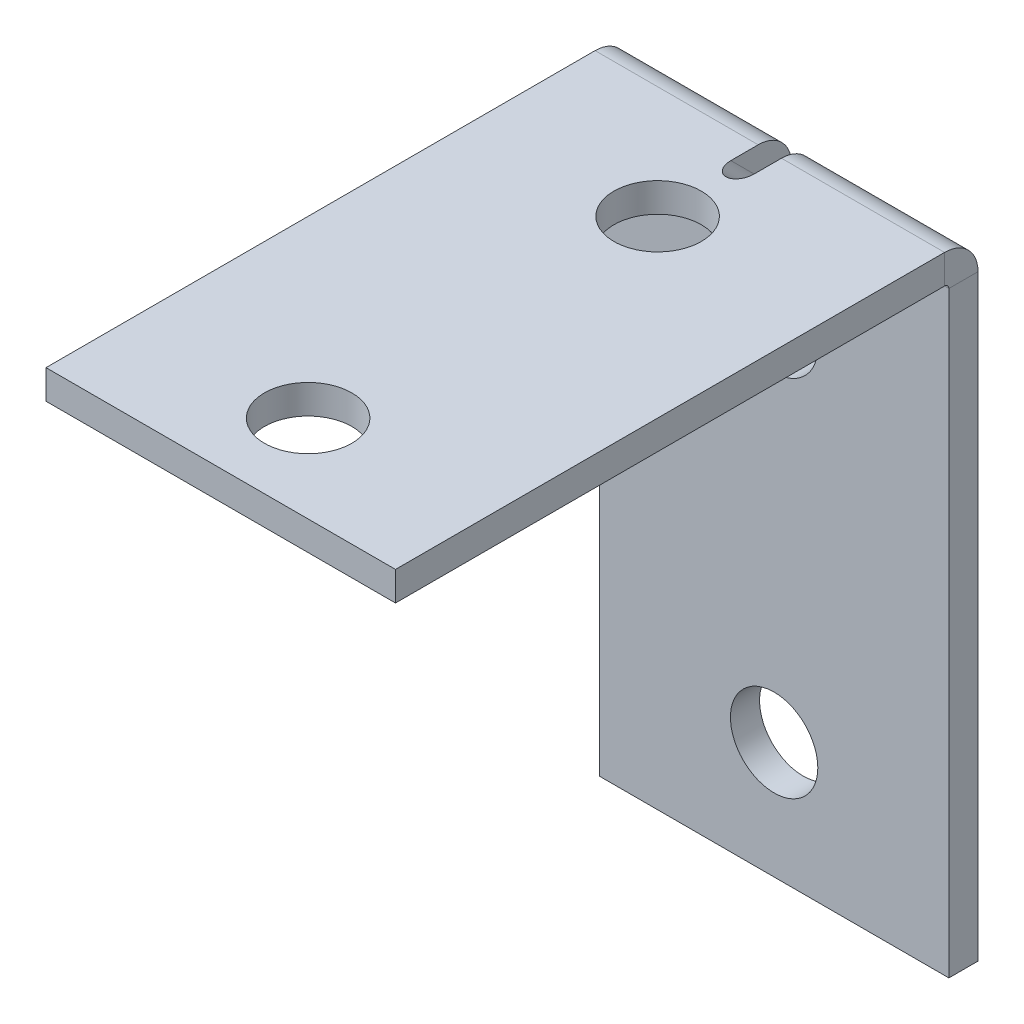
ISO-10303-21;
HEADER;
FILE_DESCRIPTION(('STEP AP214'),'2;1');
FILE_NAME('part.step','',(''),(''),'','','');
FILE_SCHEMA(('AUTOMOTIVE_DESIGN { 1 0 10303 214 1 1 1 1 }'));
ENDSEC;
DATA;
#1=APPLICATION_CONTEXT('core data for automotive mechanical design processes');
#2=APPLICATION_PROTOCOL_DEFINITION('international standard','automotive_design',2000,#1);
#3=PRODUCT_CONTEXT('',#1,'mechanical');
#4=PRODUCT('Part','Part','',(#3));
#5=PRODUCT_RELATED_PRODUCT_CATEGORY('part','',(#4));
#6=PRODUCT_DEFINITION_FORMATION('','',#4);
#7=PRODUCT_DEFINITION_CONTEXT('part definition',#1,'design');
#8=PRODUCT_DEFINITION('design','',#6,#7);
#9=PRODUCT_DEFINITION_SHAPE('','',#8);
#10=(LENGTH_UNIT() NAMED_UNIT(*) SI_UNIT(.MILLI.,.METRE.));
#11=(NAMED_UNIT(*) PLANE_ANGLE_UNIT() SI_UNIT($,.RADIAN.));
#12=(NAMED_UNIT(*) SI_UNIT($,.STERADIAN.) SOLID_ANGLE_UNIT());
#13=UNCERTAINTY_MEASURE_WITH_UNIT(LENGTH_MEASURE(1.E-05),#10,'distance_accuracy_value','');
#14=(GEOMETRIC_REPRESENTATION_CONTEXT(3) GLOBAL_UNCERTAINTY_ASSIGNED_CONTEXT((#13)) GLOBAL_UNIT_ASSIGNED_CONTEXT((#10,
#11,#12)) REPRESENTATION_CONTEXT('',''));
#15=CARTESIAN_POINT('',(0.,0.,0.));
#16=DIRECTION('',(0.,0.,1.));
#17=DIRECTION('',(1.,0.,0.));
#18=AXIS2_PLACEMENT_3D('',#15,#16,#17);
#19=CARTESIAN_POINT('',(0.,0.,-5.));
#20=DIRECTION('',(0.,0.,-1.));
#21=DIRECTION('',(-1.,0.,0.));
#22=AXIS2_PLACEMENT_3D('',#19,#20,#21);
#23=PLANE('',#22);
#24=CARTESIAN_POINT('',(0.,-30.,-5.));
#25=DIRECTION('',(0.,0.,1.));
#26=DIRECTION('',(1.,0.,0.));
#27=AXIS2_PLACEMENT_3D('',#24,#25,#26);
#28=CIRCLE('',#27,7.5);
#29=CARTESIAN_POINT('',(7.5,-30.,-5.));
#30=VERTEX_POINT('',#29);
#31=EDGE_CURVE('E448',#30,#30,#28,.T.);
#32=ORIENTED_EDGE('',*,*,#31,.T.);
#33=EDGE_LOOP('',(#32));
#34=FACE_BOUND('',#33,.T.);
#35=CARTESIAN_POINT('',(0.,32.5,-5.));
#36=DIRECTION('',(0.,0.,1.));
#37=DIRECTION('',(1.,0.,0.));
#38=AXIS2_PLACEMENT_3D('',#35,#36,#37);
#39=CIRCLE('',#38,7.5);
#40=CARTESIAN_POINT('',(7.5,32.5,-5.));
#41=VERTEX_POINT('',#40);
#42=EDGE_CURVE('E459',#41,#41,#39,.T.);
#43=ORIENTED_EDGE('',*,*,#42,.T.);
#44=EDGE_LOOP('',(#43));
#45=FACE_BOUND('',#44,.T.);
#46=CARTESIAN_POINT('',(0.,47.805109710044,-5.));
#47=DIRECTION('',(0.,0.,-1.));
#48=DIRECTION('',(0.,-1.,0.));
#49=AXIS2_PLACEMENT_3D('',#46,#47,#48);
#50=ELLIPSE('',#49,2.82842712474619,2.);
#51=CARTESIAN_POINT('',(1.99999999999997,47.805109710044,-5.));
#52=VERTEX_POINT('',#51);
#53=CARTESIAN_POINT('',(-2.00000000000003,47.805109710044,-5.));
#54=VERTEX_POINT('',#53);
#55=EDGE_CURVE('E175',#52,#54,#50,.T.);
#56=ORIENTED_EDGE('',*,*,#55,.F.);
#57=DIRECTION('',(0.,1.,0.));
#58=VECTOR('',#57,1.);
#59=CARTESIAN_POINT('',(1.99999999999997,0.,-5.));
#60=LINE('',#59,#58);
#61=CARTESIAN_POINT('',(1.99999999999997,52.5,-5.));
#62=VERTEX_POINT('',#61);
#63=EDGE_CURVE('E182',#52,#62,#60,.T.);
#64=ORIENTED_EDGE('',*,*,#63,.T.);
#65=DIRECTION('',(-1.,0.,0.));
#66=VECTOR('',#65,1.);
#67=CARTESIAN_POINT('',(-30.,52.5,-5.));
#68=LINE('',#67,#66);
#69=CARTESIAN_POINT('',(30.,52.5,-5.));
#70=VERTEX_POINT('',#69);
#71=EDGE_CURVE('E256',#62,#70,#68,.F.);
#72=ORIENTED_EDGE('',*,*,#71,.T.);
#73=DIRECTION('',(0.,1.,0.));
#74=VECTOR('',#73,1.);
#75=CARTESIAN_POINT('',(30.,-50.,-5.));
#76=LINE('',#75,#74);
#77=CARTESIAN_POINT('',(30.,-50.,-5.));
#78=VERTEX_POINT('',#77);
#79=EDGE_CURVE('E290',#78,#70,#76,.T.);
#80=ORIENTED_EDGE('',*,*,#79,.F.);
#81=DIRECTION('',(1.,0.,0.));
#82=VECTOR('',#81,1.);
#83=CARTESIAN_POINT('',(-30.,-50.,-5.));
#84=LINE('',#83,#82);
#85=CARTESIAN_POINT('',(-30.,-50.,-5.));
#86=VERTEX_POINT('',#85);
#87=EDGE_CURVE('E300',#86,#78,#84,.T.);
#88=ORIENTED_EDGE('',*,*,#87,.F.);
#89=DIRECTION('',(0.,-1.,0.));
#90=VECTOR('',#89,1.);
#91=CARTESIAN_POINT('',(-30.,-50.,-5.));
#92=LINE('',#91,#90);
#93=CARTESIAN_POINT('',(-30.,52.5,-5.));
#94=VERTEX_POINT('',#93);
#95=EDGE_CURVE('E292',#94,#86,#92,.T.);
#96=ORIENTED_EDGE('',*,*,#95,.F.);
#97=CARTESIAN_POINT('',(-2.00000000000003,52.5,-5.));
#98=VERTEX_POINT('',#97);
#99=EDGE_CURVE('E195',#94,#98,#68,.F.);
#100=ORIENTED_EDGE('',*,*,#99,.T.);
#101=DIRECTION('',(0.,1.,0.));
#102=VECTOR('',#101,1.);
#103=CARTESIAN_POINT('',(-2.00000000000003,0.,-5.));
#104=LINE('',#103,#102);
#105=EDGE_CURVE('E187',#54,#98,#104,.T.);
#106=ORIENTED_EDGE('',*,*,#105,.F.);
#107=EDGE_LOOP('',(#56,#64,#72,#80,#88,#96,#100,#106));
#108=FACE_BOUND('',#107,.T.);
#109=ADVANCED_FACE('F66',(#34,#45,#108),#23,.T.);
#110=CARTESIAN_POINT('',(-30.,52.5,0.7366));
#111=DIRECTION('',(-1.,0.,0.));
#112=DIRECTION('',(0.,1.,0.));
#113=AXIS2_PLACEMENT_3D('',#110,#111,#112);
#114=CYLINDRICAL_SURFACE('',#113,5.7366);
#115=ORIENTED_EDGE('',*,*,#71,.F.);
#116=CARTESIAN_POINT('',(1.99999999999997,52.5,0.7366));
#117=DIRECTION('',(-1.,0.,0.));
#118=DIRECTION('',(0.,0.,1.));
#119=AXIS2_PLACEMENT_3D('',#116,#117,#118);
#120=CIRCLE('',#119,5.7366);
#121=CARTESIAN_POINT('',(1.99999999999997,58.2366,0.736599999999979));
#122=VERTEX_POINT('',#121);
#123=EDGE_CURVE('E191',#62,#122,#120,.F.);
#124=ORIENTED_EDGE('',*,*,#123,.T.);
#125=DIRECTION('',(-1.,0.,0.));
#126=VECTOR('',#125,1.);
#127=CARTESIAN_POINT('',(30.,58.2366,0.736599999999979));
#128=LINE('',#127,#126);
#129=CARTESIAN_POINT('',(30.,58.2366,0.736599999999979));
#130=VERTEX_POINT('',#129);
#131=EDGE_CURVE('E243',#122,#130,#128,.F.);
#132=ORIENTED_EDGE('',*,*,#131,.T.);
#133=CARTESIAN_POINT('',(30.,52.5,0.7366));
#134=DIRECTION('',(-1.,0.,0.));
#135=DIRECTION('',(0.,0.,1.));
#136=AXIS2_PLACEMENT_3D('',#133,#134,#135);
#137=CIRCLE('',#136,5.7366);
#138=EDGE_CURVE('E259',#70,#130,#137,.F.);
#139=ORIENTED_EDGE('',*,*,#138,.F.);
#140=EDGE_LOOP('',(#115,#124,#132,#139));
#141=FACE_BOUND('',#140,.T.);
#142=ADVANCED_FACE('F352',(#141),#114,.T.);
#143=CARTESIAN_POINT('',(0.,58.2366,-1.92755779003451E-13));
#144=DIRECTION('',(0.,-1.,0.));
#145=DIRECTION('',(0.,0.,-1.));
#146=AXIS2_PLACEMENT_3D('',#143,#144,#145);
#147=PLANE('',#146);
#148=CARTESIAN_POINT('',(0.,58.2366000000004,20.));
#149=DIRECTION('',(0.,-1.,0.));
#150=DIRECTION('',(0.,0.,-1.));
#151=AXIS2_PLACEMENT_3D('',#148,#149,#150);
#152=CIRCLE('',#151,7.5);
#153=CARTESIAN_POINT('',(0.,58.2366000000004,12.5));
#154=VERTEX_POINT('',#153);
#155=EDGE_CURVE('E438',#154,#154,#152,.T.);
#156=ORIENTED_EDGE('',*,*,#155,.T.);
#157=EDGE_LOOP('',(#156));
#158=FACE_BOUND('',#157,.T.);
#159=CARTESIAN_POINT('',(0.,58.2366000000006,80.));
#160=DIRECTION('',(0.,-1.,0.));
#161=DIRECTION('',(0.,0.,-1.));
#162=AXIS2_PLACEMENT_3D('',#159,#160,#161);
#163=CIRCLE('',#162,7.5);
#164=CARTESIAN_POINT('',(0.,58.2366000000006,72.5));
#165=VERTEX_POINT('',#164);
#166=EDGE_CURVE('E447',#165,#165,#163,.T.);
#167=ORIENTED_EDGE('',*,*,#166,.T.);
#168=EDGE_LOOP('',(#167));
#169=FACE_BOUND('',#168,.T.);
#170=DIRECTION('',(0.,0.,-1.));
#171=VECTOR('',#170,1.);
#172=CARTESIAN_POINT('',(1.99999999999997,58.2366,-1.92755779003451E-13));
#173=LINE('',#172,#171);
#174=CARTESIAN_POINT('',(1.99999999999997,58.2366,5.43149028995599));
#175=VERTEX_POINT('',#174);
#176=EDGE_CURVE('E14',#175,#122,#173,.T.);
#177=ORIENTED_EDGE('',*,*,#176,.F.);
#178=CARTESIAN_POINT('',(0.,58.2366,5.43149028995599));
#179=DIRECTION('',(0.,-1.,0.));
#180=DIRECTION('',(0.,0.,-1.));
#181=AXIS2_PLACEMENT_3D('',#178,#179,#180);
#182=ELLIPSE('',#181,2.8284271247462,2.);
#183=CARTESIAN_POINT('',(-2.00000000000003,58.2366,5.43149028995599));
#184=VERTEX_POINT('',#183);
#185=EDGE_CURVE('E79',#175,#184,#182,.T.);
#186=ORIENTED_EDGE('',*,*,#185,.T.);
#187=DIRECTION('',(0.,0.,-1.));
#188=VECTOR('',#187,1.);
#189=CARTESIAN_POINT('',(-2.00000000000003,58.2366,-1.92755779003451E-13));
#190=LINE('',#189,#188);
#191=CARTESIAN_POINT('',(-2.00000000000003,58.2366,0.736599999999979));
#192=VERTEX_POINT('',#191);
#193=EDGE_CURVE('E190',#184,#192,#190,.T.);
#194=ORIENTED_EDGE('',*,*,#193,.T.);
#195=CARTESIAN_POINT('',(-30.,58.2366,0.736599999999979));
#196=VERTEX_POINT('',#195);
#197=EDGE_CURVE('E237',#196,#192,#128,.F.);
#198=ORIENTED_EDGE('',*,*,#197,.F.);
#199=DIRECTION('',(0.,0.,1.));
#200=VECTOR('',#199,1.);
#201=CARTESIAN_POINT('',(-30.,58.2366,-1.92755779003451E-13));
#202=LINE('',#201,#200);
#203=CARTESIAN_POINT('',(-30.,58.2366000000003,95.));
#204=VERTEX_POINT('',#203);
#205=EDGE_CURVE('E221',#196,#204,#202,.T.);
#206=ORIENTED_EDGE('',*,*,#205,.T.);
#207=DIRECTION('',(1.,0.,0.));
#208=VECTOR('',#207,1.);
#209=CARTESIAN_POINT('',(0.,58.2366000000003,95.));
#210=LINE('',#209,#208);
#211=CARTESIAN_POINT('',(30.,58.2366000000003,95.));
#212=VERTEX_POINT('',#211);
#213=EDGE_CURVE('E222',#204,#212,#210,.T.);
#214=ORIENTED_EDGE('',*,*,#213,.T.);
#215=DIRECTION('',(0.,0.,-1.));
#216=VECTOR('',#215,1.);
#217=CARTESIAN_POINT('',(30.,58.2366,-1.92755779003451E-13));
#218=LINE('',#217,#216);
#219=EDGE_CURVE('E227',#212,#130,#218,.T.);
#220=ORIENTED_EDGE('',*,*,#219,.T.);
#221=ORIENTED_EDGE('',*,*,#131,.F.);
#222=EDGE_LOOP('',(#177,#186,#194,#198,#206,#214,#220,#221));
#223=FACE_BOUND('',#222,.T.);
#224=ADVANCED_FACE('F346',(#158,#169,#223),#147,.F.);
#225=CARTESIAN_POINT('',(-30.,52.5,0.7366));
#226=DIRECTION('',(-1.,0.,0.));
#227=DIRECTION('',(0.,1.,0.));
#228=AXIS2_PLACEMENT_3D('',#225,#226,#227);
#229=CYLINDRICAL_SURFACE('',#228,0.736599999999997);
#230=DIRECTION('',(-1.,0.,0.));
#231=VECTOR('',#230,1.);
#232=CARTESIAN_POINT('',(-30.,52.5,0.));
#233=LINE('',#232,#231);
#234=CARTESIAN_POINT('',(-30.,52.5,0.));
#235=VERTEX_POINT('',#234);
#236=CARTESIAN_POINT('',(-4.99534323469557,52.5,0.));
#237=VERTEX_POINT('',#236);
#238=EDGE_CURVE('E275',#235,#237,#233,.F.);
#239=ORIENTED_EDGE('',*,*,#238,.T.);
#240=CARTESIAN_POINT('',(-4.99534323469556,52.5,0.));
#241=CARTESIAN_POINT('',(-4.99660383623209,52.5413648015892,-3.59492280993839E-05));
#242=CARTESIAN_POINT('',(-4.99750479846404,52.5827272818708,0.0034822095934238));
#243=CARTESIAN_POINT('',(-4.99880650055586,52.6642593974038,0.0173694003444505));
#244=CARTESIAN_POINT('',(-4.99920766740467,52.7044300222048,0.0277325727908974));
#245=CARTESIAN_POINT('',(-4.99973034707194,52.7824809559261,0.0550588747162718));
#246=CARTESIAN_POINT('',(-4.99985174468384,52.8203603150729,0.0720247197587768));
#247=CARTESIAN_POINT('',(-4.99998337426884,52.8927338379098,0.112061255287455));
#248=CARTESIAN_POINT('',(-4.99999362350331,52.9272285264151,0.135130997267407));
#249=CARTESIAN_POINT('',(-5.00000216637799,52.9919049965375,0.186760264511239));
#250=CARTESIAN_POINT('',(-5.00000044439675,53.0220810903515,0.215326915534693));
#251=CARTESIAN_POINT('',(-4.9999992707508,53.0772162778244,0.277126666541701));
#252=CARTESIAN_POINT('',(-4.99999981953819,53.1021743315358,0.310360694524182));
#253=CARTESIAN_POINT('',(-4.99993049157744,53.1461656845676,0.380557102542336));
#254=CARTESIAN_POINT('',(-4.99986058667116,53.1651966110184,0.417520967962809));
#255=CARTESIAN_POINT('',(-4.99950033689621,53.1967722455161,0.494110624455161));
#256=CARTESIAN_POINT('',(-4.99921012437424,53.2093208401297,0.533734804358305));
#257=CARTESIAN_POINT('',(-4.99837575863665,53.2244842426625,0.600765953759534));
#258=CARTESIAN_POINT('',(-4.99795124361251,53.2290251397514,0.627754375732378));
#259=CARTESIAN_POINT('',(-4.99685147074266,53.235082888944,0.682026167789546));
#260=CARTESIAN_POINT('',(-4.99617655392041,53.2366038361206,0.709309087955254));
#261=CARTESIAN_POINT('',(-4.99534323469556,53.2366,0.736599999999997));
#262=B_SPLINE_CURVE_WITH_KNOTS('',3,(#240,#241,#242,#243,#244,#245,#246,#247,#248,#249,#250,
#251,#252,#253,#254,#255,#256,#257,#258,#259,#260,#261),.UNSPECIFIED.,.F.,.F.,(4,2,2,2,2,2,2,2,
2,2,4),(0.,0.123982182526455,0.247858370870125,0.371785561254277,0.495693505450882,
0.619763169613906,0.743857537149,0.868001521024178,0.992070986107039,1.07402564704562,
1.15586910080101),.UNSPECIFIED.);
#263=CARTESIAN_POINT('',(-4.99534323469556,53.2366,0.736599999999997));
#264=VERTEX_POINT('',#263);
#265=EDGE_CURVE('E328',#237,#264,#262,.T.);
#266=ORIENTED_EDGE('',*,*,#265,.T.);
#267=DIRECTION('',(-1.,0.,0.));
#268=VECTOR('',#267,1.);
#269=CARTESIAN_POINT('',(30.,53.2366,0.736599999999997));
#270=LINE('',#269,#268);
#271=CARTESIAN_POINT('',(-30.,53.2366,0.736599999999997));
#272=VERTEX_POINT('',#271);
#273=EDGE_CURVE('E255',#264,#272,#270,.T.);
#274=ORIENTED_EDGE('',*,*,#273,.T.);
#275=CARTESIAN_POINT('',(-30.,52.5,0.7366));
#276=DIRECTION('',(-1.,0.,0.));
#277=DIRECTION('',(0.,0.,1.));
#278=AXIS2_PLACEMENT_3D('',#275,#276,#277);
#279=CIRCLE('',#278,0.736599999999997);
#280=EDGE_CURVE('E216',#272,#235,#279,.T.);
#281=ORIENTED_EDGE('',*,*,#280,.T.);
#282=EDGE_LOOP('',(#239,#266,#274,#281));
#283=FACE_BOUND('',#282,.T.);
#284=ADVANCED_FACE('F349',(#283),#229,.F.);
#285=CARTESIAN_POINT('',(30.,-50.,-5.));
#286=DIRECTION('',(1.,0.,0.));
#287=DIRECTION('',(0.,0.,-1.));
#288=AXIS2_PLACEMENT_3D('',#285,#286,#287);
#289=PLANE('',#288);
#290=DIRECTION('',(0.,1.,0.));
#291=VECTOR('',#290,1.);
#292=CARTESIAN_POINT('',(30.,-50.,0.));
#293=LINE('',#292,#291);
#294=CARTESIAN_POINT('',(30.,-50.,0.));
#295=VERTEX_POINT('',#294);
#296=CARTESIAN_POINT('',(30.,52.5,0.));
#297=VERTEX_POINT('',#296);
#298=EDGE_CURVE('E283',#295,#297,#293,.T.);
#299=ORIENTED_EDGE('',*,*,#298,.F.);
#300=DIRECTION('',(0.,0.,1.));
#301=VECTOR('',#300,1.);
#302=CARTESIAN_POINT('',(30.,-50.,-5.));
#303=LINE('',#302,#301);
#304=EDGE_CURVE('E315',#78,#295,#303,.T.);
#305=ORIENTED_EDGE('',*,*,#304,.F.);
#306=ORIENTED_EDGE('',*,*,#79,.T.);
#307=DIRECTION('',(0.,0.,-1.));
#308=VECTOR('',#307,1.);
#309=CARTESIAN_POINT('',(30.,52.5,0.));
#310=LINE('',#309,#308);
#311=EDGE_CURVE('E278',#297,#70,#310,.T.);
#312=ORIENTED_EDGE('',*,*,#311,.F.);
#313=EDGE_LOOP('',(#299,#305,#306,#312));
#314=FACE_BOUND('',#313,.T.);
#315=ADVANCED_FACE('F74',(#314),#289,.T.);
#316=CARTESIAN_POINT('',(-30.,-50.,-5.));
#317=DIRECTION('',(0.,-1.,0.));
#318=DIRECTION('',(0.,0.,-1.));
#319=AXIS2_PLACEMENT_3D('',#316,#317,#318);
#320=PLANE('',#319);
#321=DIRECTION('',(1.,0.,0.));
#322=VECTOR('',#321,1.);
#323=CARTESIAN_POINT('',(-30.,-50.,0.));
#324=LINE('',#323,#322);
#325=CARTESIAN_POINT('',(-30.,-50.,0.));
#326=VERTEX_POINT('',#325);
#327=EDGE_CURVE('E291',#326,#295,#324,.T.);
#328=ORIENTED_EDGE('',*,*,#327,.F.);
#329=DIRECTION('',(0.,0.,1.));
#330=VECTOR('',#329,1.);
#331=CARTESIAN_POINT('',(-30.,-50.,-5.));
#332=LINE('',#331,#330);
#333=EDGE_CURVE('E301',#86,#326,#332,.T.);
#334=ORIENTED_EDGE('',*,*,#333,.F.);
#335=ORIENTED_EDGE('',*,*,#87,.T.);
#336=ORIENTED_EDGE('',*,*,#304,.T.);
#337=EDGE_LOOP('',(#328,#334,#335,#336));
#338=FACE_BOUND('',#337,.T.);
#339=ADVANCED_FACE('F394',(#338),#320,.T.);
#340=CARTESIAN_POINT('',(-30.,-50.,-5.));
#341=DIRECTION('',(-1.,0.,0.));
#342=DIRECTION('',(0.,0.,1.));
#343=AXIS2_PLACEMENT_3D('',#340,#341,#342);
#344=PLANE('',#343);
#345=DIRECTION('',(0.,-1.,0.));
#346=VECTOR('',#345,1.);
#347=CARTESIAN_POINT('',(-30.,-50.,0.));
#348=LINE('',#347,#346);
#349=EDGE_CURVE('E304',#235,#326,#348,.T.);
#350=ORIENTED_EDGE('',*,*,#349,.F.);
#351=DIRECTION('',(0.,0.,-1.));
#352=VECTOR('',#351,1.);
#353=CARTESIAN_POINT('',(-30.,52.5,0.));
#354=LINE('',#353,#352);
#355=EDGE_CURVE('E262',#235,#94,#354,.T.);
#356=ORIENTED_EDGE('',*,*,#355,.T.);
#357=ORIENTED_EDGE('',*,*,#95,.T.);
#358=ORIENTED_EDGE('',*,*,#333,.T.);
#359=EDGE_LOOP('',(#350,#356,#357,#358));
#360=FACE_BOUND('',#359,.T.);
#361=ADVANCED_FACE('F388',(#360),#344,.T.);
#362=CARTESIAN_POINT('',(0.,0.,0.));
#363=DIRECTION('',(0.,0.,-1.));
#364=DIRECTION('',(-1.,0.,0.));
#365=AXIS2_PLACEMENT_3D('',#362,#363,#364);
#366=PLANE('',#365);
#367=CARTESIAN_POINT('',(0.,-30.,0.));
#368=DIRECTION('',(0.,0.,1.));
#369=DIRECTION('',(1.,0.,0.));
#370=AXIS2_PLACEMENT_3D('',#367,#368,#369);
#371=CIRCLE('',#370,7.5);
#372=CARTESIAN_POINT('',(7.5,-30.,0.));
#373=VERTEX_POINT('',#372);
#374=EDGE_CURVE('E463',#373,#373,#371,.T.);
#375=ORIENTED_EDGE('',*,*,#374,.F.);
#376=EDGE_LOOP('',(#375));
#377=FACE_BOUND('',#376,.T.);
#378=CARTESIAN_POINT('',(0.,32.5,0.));
#379=DIRECTION('',(0.,0.,1.));
#380=DIRECTION('',(1.,0.,0.));
#381=AXIS2_PLACEMENT_3D('',#378,#379,#380);
#382=CIRCLE('',#381,7.5);
#383=CARTESIAN_POINT('',(7.5,32.5,0.));
#384=VERTEX_POINT('',#383);
#385=EDGE_CURVE('E462',#384,#384,#382,.T.);
#386=ORIENTED_EDGE('',*,*,#385,.F.);
#387=EDGE_LOOP('',(#386));
#388=FACE_BOUND('',#387,.T.);
#389=CARTESIAN_POINT('',(4.99534323469551,52.5,0.));
#390=VERTEX_POINT('',#389);
#391=EDGE_CURVE('E277',#390,#297,#233,.F.);
#392=ORIENTED_EDGE('',*,*,#391,.F.);
#393=CARTESIAN_POINT('',(0.,52.805109710044,0.));
#394=DIRECTION('',(0.,0.,-1.));
#395=DIRECTION('',(0.,-1.,0.));
#396=AXIS2_PLACEMENT_3D('',#393,#394,#395);
#397=ELLIPSE('',#396,7.07106781186548,5.);
#398=EDGE_CURVE('E91',#390,#237,#397,.T.);
#399=ORIENTED_EDGE('',*,*,#398,.T.);
#400=ORIENTED_EDGE('',*,*,#238,.F.);
#401=ORIENTED_EDGE('',*,*,#349,.T.);
#402=ORIENTED_EDGE('',*,*,#327,.T.);
#403=ORIENTED_EDGE('',*,*,#298,.T.);
#404=EDGE_LOOP('',(#392,#399,#400,#401,#402,#403));
#405=FACE_BOUND('',#404,.T.);
#406=ADVANCED_FACE('F390',(#377,#388,#405),#366,.F.);
#407=CARTESIAN_POINT('',(30.,52.5,0.7366));
#408=DIRECTION('',(1.,0.,0.));
#409=DIRECTION('',(0.,0.,-1.));
#410=AXIS2_PLACEMENT_3D('',#407,#408,#409);
#411=PLANE('',#410);
#412=DIRECTION('',(0.,-1.,0.));
#413=VECTOR('',#412,1.);
#414=CARTESIAN_POINT('',(30.,58.2366,0.736599999999979));
#415=LINE('',#414,#413);
#416=CARTESIAN_POINT('',(30.,53.2366,0.736599999999997));
#417=VERTEX_POINT('',#416);
#418=EDGE_CURVE('E212',#417,#130,#415,.F.);
#419=ORIENTED_EDGE('',*,*,#418,.F.);
#420=CARTESIAN_POINT('',(30.,52.5,0.7366));
#421=DIRECTION('',(-1.,0.,0.));
#422=DIRECTION('',(0.,0.,1.));
#423=AXIS2_PLACEMENT_3D('',#420,#421,#422);
#424=CIRCLE('',#423,0.736599999999997);
#425=EDGE_CURVE('E270',#297,#417,#424,.F.);
#426=ORIENTED_EDGE('',*,*,#425,.F.);
#427=ORIENTED_EDGE('',*,*,#311,.T.);
#428=ORIENTED_EDGE('',*,*,#138,.T.);
#429=EDGE_LOOP('',(#419,#426,#427,#428));
#430=FACE_BOUND('',#429,.T.);
#431=ADVANCED_FACE('F374',(#430),#411,.T.);
#432=CARTESIAN_POINT('',(-30.,52.5,0.7366));
#433=DIRECTION('',(1.,0.,0.));
#434=DIRECTION('',(0.,0.,-1.));
#435=AXIS2_PLACEMENT_3D('',#432,#433,#434);
#436=PLANE('',#435);
#437=ORIENTED_EDGE('',*,*,#280,.F.);
#438=DIRECTION('',(0.,-1.,0.));
#439=VECTOR('',#438,1.);
#440=CARTESIAN_POINT('',(-30.,53.2366,0.736599999999997));
#441=LINE('',#440,#439);
#442=EDGE_CURVE('E242',#272,#196,#441,.F.);
#443=ORIENTED_EDGE('',*,*,#442,.T.);
#444=CARTESIAN_POINT('',(-30.,52.5,0.7366));
#445=DIRECTION('',(-1.,0.,0.));
#446=DIRECTION('',(0.,0.,1.));
#447=AXIS2_PLACEMENT_3D('',#444,#445,#446);
#448=CIRCLE('',#447,5.7366);
#449=EDGE_CURVE('E265',#196,#94,#448,.T.);
#450=ORIENTED_EDGE('',*,*,#449,.T.);
#451=ORIENTED_EDGE('',*,*,#355,.F.);
#452=EDGE_LOOP('',(#437,#443,#450,#451));
#453=FACE_BOUND('',#452,.T.);
#454=ADVANCED_FACE('F367',(#453),#436,.F.);
#455=CARTESIAN_POINT('',(-2.00000000000003,52.5,0.7366));
#456=DIRECTION('',(-1.,0.,0.));
#457=DIRECTION('',(0.,0.,1.));
#458=AXIS2_PLACEMENT_3D('',#455,#456,#457);
#459=CIRCLE('',#458,5.7366);
#460=EDGE_CURVE('E86',#98,#192,#459,.F.);
#461=ORIENTED_EDGE('',*,*,#460,.F.);
#462=ORIENTED_EDGE('',*,*,#99,.F.);
#463=ORIENTED_EDGE('',*,*,#449,.F.);
#464=ORIENTED_EDGE('',*,*,#197,.T.);
#465=EDGE_LOOP('',(#461,#462,#463,#464));
#466=FACE_BOUND('',#465,.T.);
#467=ADVANCED_FACE('F370',(#466),#114,.T.);
#468=CARTESIAN_POINT('',(4.99534323469551,53.2366,0.736599999999997));
#469=VERTEX_POINT('',#468);
#470=EDGE_CURVE('E247',#417,#469,#270,.T.);
#471=ORIENTED_EDGE('',*,*,#470,.T.);
#472=CARTESIAN_POINT('',(4.99534323469551,53.2366,0.736599999999997));
#473=CARTESIAN_POINT('',(4.99660383623204,53.2366359492281,0.695235198410819));
#474=CARTESIAN_POINT('',(4.99750479846398,53.2331177904066,0.653872718129166));
#475=CARTESIAN_POINT('',(4.99880650055581,53.2192305996556,0.572340602596207));
#476=CARTESIAN_POINT('',(4.99920766740462,53.2088674272091,0.532169977795193));
#477=CARTESIAN_POINT('',(4.99973034707189,53.1815411252837,0.454119044073939));
#478=CARTESIAN_POINT('',(4.99985174468378,53.1645752802412,0.416239684927065));
#479=CARTESIAN_POINT('',(4.99998337426878,53.1245387447125,0.343866162090194));
#480=CARTESIAN_POINT('',(4.99999362350325,53.1014690027326,0.309371473584893));
#481=CARTESIAN_POINT('',(5.00000216637793,53.0498397354888,0.244695003462536));
#482=CARTESIAN_POINT('',(5.0000004443967,53.0212730844653,0.214518909648491));
#483=CARTESIAN_POINT('',(4.99999927075074,52.9594733334583,0.15938372217565));
#484=CARTESIAN_POINT('',(4.99999981953813,52.9262393054758,0.134425668464232));
#485=CARTESIAN_POINT('',(4.99993049157739,52.8560428974577,0.0904343154324143));
#486=CARTESIAN_POINT('',(4.9998605866711,52.8190790320372,0.071403388981564));
#487=CARTESIAN_POINT('',(4.99950033689615,52.7424893755448,0.0398277544839316));
#488=CARTESIAN_POINT('',(4.99921012437418,52.7028651956417,0.0272791598702783));
#489=CARTESIAN_POINT('',(4.99837575863659,52.6358340462405,0.0121157573374738));
#490=CARTESIAN_POINT('',(4.99795124361245,52.6088456242676,0.00757486024863124));
#491=CARTESIAN_POINT('',(4.9968514707426,52.5545738322105,0.00151711105599472));
#492=CARTESIAN_POINT('',(4.99617655392035,52.5272909120447,-3.83612055048956E-06));
#493=CARTESIAN_POINT('',(4.99534323469551,52.5,0.));
#494=B_SPLINE_CURVE_WITH_KNOTS('',3,(#472,#473,#474,#475,#476,#477,#478,#479,#480,#481,#482,
#483,#484,#485,#486,#487,#488,#489,#490,#491,#492,#493),.UNSPECIFIED.,.F.,.F.,(4,2,2,2,2,2,2,2,
2,2,4),(0.,0.123982182526453,0.247858370870122,0.371785561254279,0.49569350545088,
0.619763169613903,0.743857537148997,0.868001521024171,0.992070986107037,1.07402564704561,
1.15586910080101),.UNSPECIFIED.);
#495=EDGE_CURVE('E314',#469,#390,#494,.T.);
#496=ORIENTED_EDGE('',*,*,#495,.T.);
#497=ORIENTED_EDGE('',*,*,#391,.T.);
#498=ORIENTED_EDGE('',*,*,#425,.T.);
#499=EDGE_LOOP('',(#471,#496,#497,#498));
#500=FACE_BOUND('',#499,.T.);
#501=ADVANCED_FACE('F334',(#500),#229,.F.);
#502=CARTESIAN_POINT('',(30.,58.2366,0.));
#503=DIRECTION('',(-1.,0.,0.));
#504=DIRECTION('',(0.,0.,1.));
#505=AXIS2_PLACEMENT_3D('',#502,#503,#504);
#506=PLANE('',#505);
#507=ORIENTED_EDGE('',*,*,#418,.T.);
#508=ORIENTED_EDGE('',*,*,#219,.F.);
#509=DIRECTION('',(0.,-1.,0.));
#510=VECTOR('',#509,1.);
#511=CARTESIAN_POINT('',(30.,58.2366000000003,95.));
#512=LINE('',#511,#510);
#513=CARTESIAN_POINT('',(30.,53.2366000000003,95.));
#514=VERTEX_POINT('',#513);
#515=EDGE_CURVE('E220',#212,#514,#512,.T.);
#516=ORIENTED_EDGE('',*,*,#515,.T.);
#517=DIRECTION('',(0.,0.,1.));
#518=VECTOR('',#517,1.);
#519=CARTESIAN_POINT('',(30.,53.2366,0.));
#520=LINE('',#519,#518);
#521=EDGE_CURVE('E232',#514,#417,#520,.F.);
#522=ORIENTED_EDGE('',*,*,#521,.T.);
#523=EDGE_LOOP('',(#507,#508,#516,#522));
#524=FACE_BOUND('',#523,.T.);
#525=ADVANCED_FACE('F361',(#524),#506,.F.);
#526=CARTESIAN_POINT('',(-30.,58.2366000000003,95.));
#527=DIRECTION('',(1.,0.,0.));
#528=DIRECTION('',(0.,0.,-1.));
#529=AXIS2_PLACEMENT_3D('',#526,#527,#528);
#530=PLANE('',#529);
#531=ORIENTED_EDGE('',*,*,#442,.F.);
#532=DIRECTION('',(0.,0.,-1.));
#533=VECTOR('',#532,1.);
#534=CARTESIAN_POINT('',(-30.,53.2366000000003,95.));
#535=LINE('',#534,#533);
#536=CARTESIAN_POINT('',(-30.,53.2366000000003,95.));
#537=VERTEX_POINT('',#536);
#538=EDGE_CURVE('E235',#272,#537,#535,.F.);
#539=ORIENTED_EDGE('',*,*,#538,.T.);
#540=DIRECTION('',(0.,-1.,0.));
#541=VECTOR('',#540,1.);
#542=CARTESIAN_POINT('',(-30.,58.2366000000003,95.));
#543=LINE('',#542,#541);
#544=EDGE_CURVE('E215',#204,#537,#543,.T.);
#545=ORIENTED_EDGE('',*,*,#544,.F.);
#546=ORIENTED_EDGE('',*,*,#205,.F.);
#547=EDGE_LOOP('',(#531,#539,#545,#546));
#548=FACE_BOUND('',#547,.T.);
#549=ADVANCED_FACE('F358',(#548),#530,.F.);
#550=CARTESIAN_POINT('',(0.,53.2366,-1.75298372309235E-13));
#551=DIRECTION('',(0.,-1.,0.));
#552=DIRECTION('',(0.,0.,-1.));
#553=AXIS2_PLACEMENT_3D('',#550,#551,#552);
#554=PLANE('',#553);
#555=CARTESIAN_POINT('',(0.,53.2366000000001,20.));
#556=DIRECTION('',(0.,-1.,0.));
#557=DIRECTION('',(0.,0.,-1.));
#558=AXIS2_PLACEMENT_3D('',#555,#556,#557);
#559=CIRCLE('',#558,7.5);
#560=CARTESIAN_POINT('',(0.,53.2366,12.5));
#561=VERTEX_POINT('',#560);
#562=EDGE_CURVE('E442',#561,#561,#559,.T.);
#563=ORIENTED_EDGE('',*,*,#562,.F.);
#564=EDGE_LOOP('',(#563));
#565=FACE_BOUND('',#564,.T.);
#566=CARTESIAN_POINT('',(0.,53.2366000000003,80.));
#567=DIRECTION('',(0.,-1.,0.));
#568=DIRECTION('',(0.,0.,-1.));
#569=AXIS2_PLACEMENT_3D('',#566,#567,#568);
#570=CIRCLE('',#569,7.5);
#571=CARTESIAN_POINT('',(0.,53.2366000000003,72.5));
#572=VERTEX_POINT('',#571);
#573=EDGE_CURVE('E446',#572,#572,#570,.T.);
#574=ORIENTED_EDGE('',*,*,#573,.F.);
#575=EDGE_LOOP('',(#574));
#576=FACE_BOUND('',#575,.T.);
#577=CARTESIAN_POINT('',(0.,53.2366,0.431490289955979));
#578=DIRECTION('',(0.,-1.,0.));
#579=DIRECTION('',(0.,0.,-1.));
#580=AXIS2_PLACEMENT_3D('',#577,#578,#579);
#581=ELLIPSE('',#580,7.0710678118655,5.);
#582=EDGE_CURVE('E206',#469,#264,#581,.T.);
#583=ORIENTED_EDGE('',*,*,#582,.F.);
#584=ORIENTED_EDGE('',*,*,#470,.F.);
#585=ORIENTED_EDGE('',*,*,#521,.F.);
#586=DIRECTION('',(-1.,0.,0.));
#587=VECTOR('',#586,1.);
#588=CARTESIAN_POINT('',(30.,53.2366000000003,95.));
#589=LINE('',#588,#587);
#590=EDGE_CURVE('E229',#537,#514,#589,.F.);
#591=ORIENTED_EDGE('',*,*,#590,.F.);
#592=ORIENTED_EDGE('',*,*,#538,.F.);
#593=ORIENTED_EDGE('',*,*,#273,.F.);
#594=EDGE_LOOP('',(#583,#584,#585,#591,#592,#593));
#595=FACE_BOUND('',#594,.T.);
#596=ADVANCED_FACE('F355',(#565,#576,#595),#554,.T.);
#597=CARTESIAN_POINT('',(30.,58.2366000000003,95.));
#598=DIRECTION('',(0.,0.,-1.));
#599=DIRECTION('',(0.,1.,0.));
#600=AXIS2_PLACEMENT_3D('',#597,#598,#599);
#601=PLANE('',#600);
#602=ORIENTED_EDGE('',*,*,#590,.T.);
#603=ORIENTED_EDGE('',*,*,#515,.F.);
#604=ORIENTED_EDGE('',*,*,#213,.F.);
#605=ORIENTED_EDGE('',*,*,#544,.T.);
#606=EDGE_LOOP('',(#602,#603,#604,#605));
#607=FACE_BOUND('',#606,.T.);
#608=ADVANCED_FACE('F341',(#607),#601,.F.);
#609=CARTESIAN_POINT('',(0.,61.8366,9.03149028995598));
#610=DIRECTION('',(0.,-0.707106781186548,-0.707106781186547));
#611=DIRECTION('',(0.,0.707106781186547,-0.707106781186548));
#612=AXIS2_PLACEMENT_3D('',#609,#610,#611);
#613=CYLINDRICAL_SURFACE('',#612,5.);
#614=ORIENTED_EDGE('',*,*,#265,.F.);
#615=ORIENTED_EDGE('',*,*,#398,.F.);
#616=ORIENTED_EDGE('',*,*,#495,.F.);
#617=ORIENTED_EDGE('',*,*,#582,.T.);
#618=EDGE_LOOP('',(#614,#615,#616,#617));
#619=FACE_BOUND('',#618,.T.);
#620=ADVANCED_FACE('F340',(#619),#613,.T.);
#621=CARTESIAN_POINT('',(0.,61.8366,9.03149028995598));
#622=DIRECTION('',(0.,-0.707106781186548,-0.707106781186547));
#623=DIRECTION('',(0.,0.707106781186547,-0.707106781186548));
#624=AXIS2_PLACEMENT_3D('',#621,#622,#623);
#625=CYLINDRICAL_SURFACE('',#624,2.);
#626=ORIENTED_EDGE('',*,*,#55,.T.);
#627=DIRECTION('',(0.,-0.707106781186548,-0.707106781186547));
#628=VECTOR('',#627,1.);
#629=CARTESIAN_POINT('',(-2.00000000000003,61.8366,9.03149028995598));
#630=LINE('',#629,#628);
#631=EDGE_CURVE('E174',#54,#184,#630,.F.);
#632=ORIENTED_EDGE('',*,*,#631,.T.);
#633=ORIENTED_EDGE('',*,*,#185,.F.);
#634=DIRECTION('',(0.,-0.707106781186548,-0.707106781186547));
#635=VECTOR('',#634,1.);
#636=CARTESIAN_POINT('',(1.99999999999997,61.8366,9.03149028995598));
#637=LINE('',#636,#635);
#638=EDGE_CURVE('E178',#175,#52,#637,.T.);
#639=ORIENTED_EDGE('',*,*,#638,.T.);
#640=EDGE_LOOP('',(#626,#632,#633,#639));
#641=FACE_BOUND('',#640,.T.);
#642=ADVANCED_FACE('F172',(#641),#625,.F.);
#643=CARTESIAN_POINT('',(1.99999999999997,0.,0.));
#644=DIRECTION('',(-1.,0.,0.));
#645=DIRECTION('',(0.,0.,1.));
#646=AXIS2_PLACEMENT_3D('',#643,#644,#645);
#647=PLANE('',#646);
#648=ORIENTED_EDGE('',*,*,#638,.F.);
#649=ORIENTED_EDGE('',*,*,#176,.T.);
#650=ORIENTED_EDGE('',*,*,#123,.F.);
#651=ORIENTED_EDGE('',*,*,#63,.F.);
#652=EDGE_LOOP('',(#648,#649,#650,#651));
#653=FACE_BOUND('',#652,.T.);
#654=ADVANCED_FACE('F436',(#653),#647,.T.);
#655=CARTESIAN_POINT('',(-2.00000000000003,0.,0.));
#656=DIRECTION('',(-1.,0.,0.));
#657=DIRECTION('',(0.,0.,1.));
#658=AXIS2_PLACEMENT_3D('',#655,#656,#657);
#659=PLANE('',#658);
#660=ORIENTED_EDGE('',*,*,#105,.T.);
#661=ORIENTED_EDGE('',*,*,#460,.T.);
#662=ORIENTED_EDGE('',*,*,#193,.F.);
#663=ORIENTED_EDGE('',*,*,#631,.F.);
#664=EDGE_LOOP('',(#660,#661,#662,#663));
#665=FACE_BOUND('',#664,.T.);
#666=ADVANCED_FACE('F184',(#665),#659,.F.);
#667=CARTESIAN_POINT('',(0.,58.2366000000006,80.));
#668=DIRECTION('',(0.,-1.,0.));
#669=DIRECTION('',(0.,0.,-1.));
#670=AXIS2_PLACEMENT_3D('',#667,#668,#669);
#671=CYLINDRICAL_SURFACE('',#670,7.5);
#672=ORIENTED_EDGE('',*,*,#166,.F.);
#673=EDGE_LOOP('',(#672));
#674=FACE_BOUND('',#673,.T.);
#675=ORIENTED_EDGE('',*,*,#573,.T.);
#676=EDGE_LOOP('',(#675));
#677=FACE_BOUND('',#676,.T.);
#678=ADVANCED_FACE('F488',(#674,#677),#671,.F.);
#679=CARTESIAN_POINT('',(0.,58.2366000000004,20.));
#680=DIRECTION('',(0.,-1.,0.));
#681=DIRECTION('',(0.,0.,-1.));
#682=AXIS2_PLACEMENT_3D('',#679,#680,#681);
#683=CYLINDRICAL_SURFACE('',#682,7.5);
#684=ORIENTED_EDGE('',*,*,#155,.F.);
#685=EDGE_LOOP('',(#684));
#686=FACE_BOUND('',#685,.T.);
#687=ORIENTED_EDGE('',*,*,#562,.T.);
#688=EDGE_LOOP('',(#687));
#689=FACE_BOUND('',#688,.T.);
#690=ADVANCED_FACE('F482',(#686,#689),#683,.F.);
#691=CARTESIAN_POINT('',(0.,32.5,-5.));
#692=DIRECTION('',(0.,0.,1.));
#693=DIRECTION('',(1.,0.,0.));
#694=AXIS2_PLACEMENT_3D('',#691,#692,#693);
#695=CYLINDRICAL_SURFACE('',#694,7.5);
#696=ORIENTED_EDGE('',*,*,#42,.F.);
#697=EDGE_LOOP('',(#696));
#698=FACE_BOUND('',#697,.T.);
#699=ORIENTED_EDGE('',*,*,#385,.T.);
#700=EDGE_LOOP('',(#699));
#701=FACE_BOUND('',#700,.T.);
#702=ADVANCED_FACE('F471',(#698,#701),#695,.F.);
#703=CARTESIAN_POINT('',(0.,-30.,-5.));
#704=DIRECTION('',(0.,0.,1.));
#705=DIRECTION('',(1.,0.,0.));
#706=AXIS2_PLACEMENT_3D('',#703,#704,#705);
#707=CYLINDRICAL_SURFACE('',#706,7.5);
#708=ORIENTED_EDGE('',*,*,#31,.F.);
#709=EDGE_LOOP('',(#708));
#710=FACE_BOUND('',#709,.T.);
#711=ORIENTED_EDGE('',*,*,#374,.T.);
#712=EDGE_LOOP('',(#711));
#713=FACE_BOUND('',#712,.T.);
#714=ADVANCED_FACE('F472',(#710,#713),#707,.F.);
#715=CLOSED_SHELL('',(#109,#142,#224,#284,#315,#339,#361,#406,#431,#454,#467,#501,#525,#549,
#596,#608,#620,#642,#654,#666,#678,#690,#702,#714));
#716=MANIFOLD_SOLID_BREP('B2',#715);
#717=ADVANCED_BREP_SHAPE_REPRESENTATION('',(#18,#716),#14);
#718=SHAPE_DEFINITION_REPRESENTATION(#9,#717);
ENDSEC;
END-ISO-10303-21;
